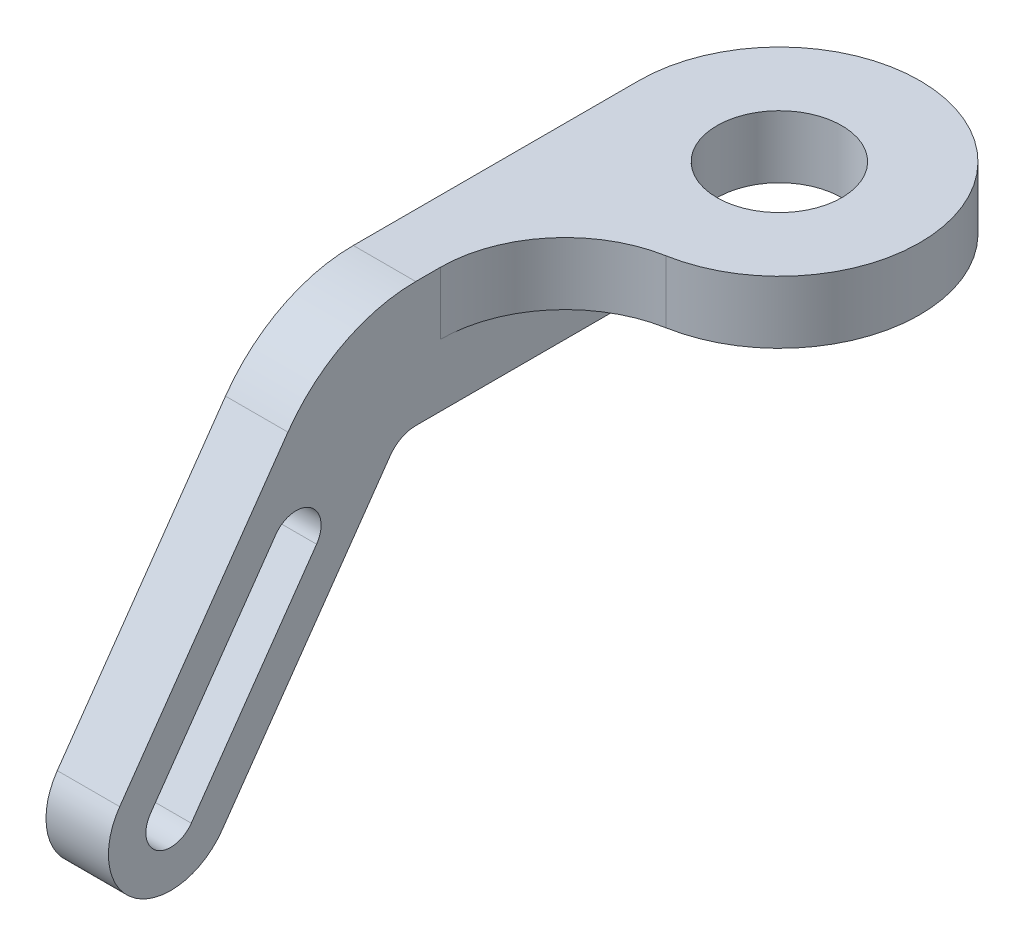
ISO-10303-21;
HEADER;
FILE_DESCRIPTION(('STEP AP214'),'2;1');
FILE_NAME('part.step','',(''),(''),'','','');
FILE_SCHEMA(('AUTOMOTIVE_DESIGN { 1 0 10303 214 1 1 1 1 }'));
ENDSEC;
DATA;
#1=APPLICATION_CONTEXT('core data for automotive mechanical design processes');
#2=APPLICATION_PROTOCOL_DEFINITION('international standard','automotive_design',2000,#1);
#3=PRODUCT_CONTEXT('',#1,'mechanical');
#4=PRODUCT('Part','Part','',(#3));
#5=PRODUCT_RELATED_PRODUCT_CATEGORY('part','',(#4));
#6=PRODUCT_DEFINITION_FORMATION('','',#4);
#7=PRODUCT_DEFINITION_CONTEXT('part definition',#1,'design');
#8=PRODUCT_DEFINITION('design','',#6,#7);
#9=PRODUCT_DEFINITION_SHAPE('','',#8);
#10=(LENGTH_UNIT() NAMED_UNIT(*) SI_UNIT(.MILLI.,.METRE.));
#11=(NAMED_UNIT(*) PLANE_ANGLE_UNIT() SI_UNIT($,.RADIAN.));
#12=(NAMED_UNIT(*) SI_UNIT($,.STERADIAN.) SOLID_ANGLE_UNIT());
#13=UNCERTAINTY_MEASURE_WITH_UNIT(LENGTH_MEASURE(1.E-05),#10,'distance_accuracy_value','');
#14=(GEOMETRIC_REPRESENTATION_CONTEXT(3) GLOBAL_UNCERTAINTY_ASSIGNED_CONTEXT((#13)) GLOBAL_UNIT_ASSIGNED_CONTEXT((#10,
#11,#12)) REPRESENTATION_CONTEXT('',''));
#15=CARTESIAN_POINT('',(0.,0.,0.));
#16=DIRECTION('',(0.,0.,1.));
#17=DIRECTION('',(1.,0.,0.));
#18=AXIS2_PLACEMENT_3D('',#15,#16,#17);
#19=CARTESIAN_POINT('',(10.,0.,-58.7769342618273));
#20=DIRECTION('',(0.,0.,1.));
#21=DIRECTION('',(1.,0.,0.));
#22=AXIS2_PLACEMENT_3D('',#19,#20,#21);
#23=PLANE('',#22);
#24=DIRECTION('',(-1.,0.,0.));
#25=VECTOR('',#24,1.);
#26=CARTESIAN_POINT('',(10.,-10.,-58.7769342618273));
#27=LINE('',#26,#25);
#28=CARTESIAN_POINT('',(10.,-10.,-58.7769342618273));
#29=VERTEX_POINT('',#28);
#30=CARTESIAN_POINT('',(0.,-10.,-58.7769342618273));
#31=VERTEX_POINT('',#30);
#32=EDGE_CURVE('E190',#29,#31,#27,.T.);
#33=ORIENTED_EDGE('',*,*,#32,.F.);
#34=DIRECTION('',(0.,1.,0.));
#35=VECTOR('',#34,1.);
#36=CARTESIAN_POINT('',(10.,0.,-58.7769342618273));
#37=LINE('',#36,#35);
#38=CARTESIAN_POINT('',(10.,-20.,-58.7769342618273));
#39=VERTEX_POINT('',#38);
#40=EDGE_CURVE('E209',#39,#29,#37,.T.);
#41=ORIENTED_EDGE('',*,*,#40,.F.);
#42=DIRECTION('',(-1.,0.,0.));
#43=VECTOR('',#42,1.);
#44=CARTESIAN_POINT('',(10.,-20.,-58.7769342618273));
#45=LINE('',#44,#43);
#46=CARTESIAN_POINT('',(0.,-20.,-58.7769342618273));
#47=VERTEX_POINT('',#46);
#48=EDGE_CURVE('E215',#39,#47,#45,.T.);
#49=ORIENTED_EDGE('',*,*,#48,.T.);
#50=DIRECTION('',(0.,1.,0.));
#51=VECTOR('',#50,1.);
#52=CARTESIAN_POINT('',(0.,0.,-58.7769342618273));
#53=LINE('',#52,#51);
#54=EDGE_CURVE('E223',#47,#31,#53,.T.);
#55=ORIENTED_EDGE('',*,*,#54,.T.);
#56=EDGE_LOOP('',(#33,#41,#49,#55));
#57=FACE_BOUND('',#56,.T.);
#58=ADVANCED_FACE('F40',(#57),#23,.F.);
#59=CARTESIAN_POINT('',(10.,-49.1491226573396,34.4145861810626));
#60=DIRECTION('',(0.,-0.573576436351044,-0.819152044288994));
#61=DIRECTION('',(0.,0.819152044288994,-0.573576436351044));
#62=AXIS2_PLACEMENT_3D('',#59,#60,#61);
#63=PLANE('',#62);
#64=DIRECTION('',(0.,-0.819152044288993,0.573576436351044));
#65=VECTOR('',#64,1.);
#66=CARTESIAN_POINT('',(10.,-49.1491226573396,34.4145861810626));
#67=LINE('',#66,#65);
#68=CARTESIAN_POINT('',(10.,-10.6605890912239,7.46462484343114));
#69=VERTEX_POINT('',#68);
#70=CARTESIAN_POINT('',(10.,-49.1491226573396,34.4145861810626));
#71=VERTEX_POINT('',#70);
#72=EDGE_CURVE('E201',#69,#71,#67,.T.);
#73=ORIENTED_EDGE('',*,*,#72,.F.);
#74=DIRECTION('',(-1.,0.,0.));
#75=VECTOR('',#74,1.);
#76=CARTESIAN_POINT('',(10.,-10.6605890912239,7.46462484343114));
#77=LINE('',#76,#75);
#78=CARTESIAN_POINT('',(0.,-10.6605890912239,7.46462484343114));
#79=VERTEX_POINT('',#78);
#80=EDGE_CURVE('E246',#69,#79,#77,.T.);
#81=ORIENTED_EDGE('',*,*,#80,.T.);
#82=DIRECTION('',(0.,-0.819152044288993,0.573576436351044));
#83=VECTOR('',#82,1.);
#84=CARTESIAN_POINT('',(0.,-49.1491226573396,34.4145861810626));
#85=LINE('',#84,#83);
#86=CARTESIAN_POINT('',(0.,-49.1491226573396,34.4145861810626));
#87=VERTEX_POINT('',#86);
#88=EDGE_CURVE('E200',#79,#87,#85,.T.);
#89=ORIENTED_EDGE('',*,*,#88,.T.);
#90=DIRECTION('',(-1.,0.,0.));
#91=VECTOR('',#90,1.);
#92=CARTESIAN_POINT('',(10.,-49.1491226573396,34.4145861810626));
#93=LINE('',#92,#91);
#94=EDGE_CURVE('E233',#71,#87,#93,.T.);
#95=ORIENTED_EDGE('',*,*,#94,.F.);
#96=EDGE_LOOP('',(#73,#81,#89,#95));
#97=FACE_BOUND('',#96,.T.);
#98=ADVANCED_FACE('F306',(#97),#63,.F.);
#99=CARTESIAN_POINT('',(10.,-20.,-10.4113410110349));
#100=DIRECTION('',(0.,0.573576436351043,0.819152044288994));
#101=DIRECTION('',(0.,-0.819152044288994,0.573576436351043));
#102=AXIS2_PLACEMENT_3D('',#99,#100,#101);
#103=PLANE('',#102);
#104=DIRECTION('',(0.,0.819152044288994,-0.573576436351044));
#105=VECTOR('',#104,1.);
#106=CARTESIAN_POINT('',(0.,-20.,-10.4113410110349));
#107=LINE('',#106,#105);
#108=CARTESIAN_POINT('',(0.,-60.6206513843605,18.0315452952828));
#109=VERTEX_POINT('',#108);
#110=CARTESIAN_POINT('',(0.,-22.1321178182448,-8.91841604234871));
#111=VERTEX_POINT('',#110);
#112=EDGE_CURVE('E217',#109,#111,#107,.T.);
#113=ORIENTED_EDGE('',*,*,#112,.T.);
#114=DIRECTION('',(-1.,0.,0.));
#115=VECTOR('',#114,1.);
#116=CARTESIAN_POINT('',(10.,-22.1321178182448,-8.91841604234871));
#117=LINE('',#116,#115);
#118=CARTESIAN_POINT('',(10.,-22.1321178182448,-8.91841604234871));
#119=VERTEX_POINT('',#118);
#120=EDGE_CURVE('E258',#111,#119,#117,.F.);
#121=ORIENTED_EDGE('',*,*,#120,.T.);
#122=DIRECTION('',(0.,0.819152044288994,-0.573576436351044));
#123=VECTOR('',#122,1.);
#124=CARTESIAN_POINT('',(10.,-20.,-10.4113410110349));
#125=LINE('',#124,#123);
#126=CARTESIAN_POINT('',(10.,-60.6206513843605,18.0315452952827));
#127=VERTEX_POINT('',#126);
#128=EDGE_CURVE('E203',#127,#119,#125,.T.);
#129=ORIENTED_EDGE('',*,*,#128,.F.);
#130=DIRECTION('',(-1.,0.,0.));
#131=VECTOR('',#130,1.);
#132=CARTESIAN_POINT('',(10.,-60.6206513843605,18.0315452952828));
#133=LINE('',#132,#131);
#134=EDGE_CURVE('E230',#127,#109,#133,.T.);
#135=ORIENTED_EDGE('',*,*,#134,.T.);
#136=EDGE_LOOP('',(#113,#121,#129,#135));
#137=FACE_BOUND('',#136,.T.);
#138=ADVANCED_FACE('F267',(#137),#103,.F.);
#139=CARTESIAN_POINT('',(10.,-20.,-58.7769342618273));
#140=DIRECTION('',(0.,1.,0.));
#141=DIRECTION('',(0.,0.,1.));
#142=AXIS2_PLACEMENT_3D('',#139,#140,#141);
#143=PLANE('',#142);
#144=DIRECTION('',(0.,0.,-1.));
#145=VECTOR('',#144,1.);
#146=CARTESIAN_POINT('',(10.,-20.,-58.7769342618273));
#147=LINE('',#146,#145);
#148=CARTESIAN_POINT('',(10.,-20.,-13.0141762637937));
#149=VERTEX_POINT('',#148);
#150=EDGE_CURVE('E207',#149,#39,#147,.T.);
#151=ORIENTED_EDGE('',*,*,#150,.F.);
#152=DIRECTION('',(-1.,0.,0.));
#153=VECTOR('',#152,1.);
#154=CARTESIAN_POINT('',(0.,-20.,-13.0141762637937));
#155=LINE('',#154,#153);
#156=CARTESIAN_POINT('',(0.,-20.,-13.0141762637937));
#157=VERTEX_POINT('',#156);
#158=EDGE_CURVE('E255',#149,#157,#155,.T.);
#159=ORIENTED_EDGE('',*,*,#158,.T.);
#160=DIRECTION('',(0.,0.,-1.));
#161=VECTOR('',#160,1.);
#162=CARTESIAN_POINT('',(0.,-20.,-58.7769342618273));
#163=LINE('',#162,#161);
#164=EDGE_CURVE('E220',#157,#47,#163,.T.);
#165=ORIENTED_EDGE('',*,*,#164,.T.);
#166=ORIENTED_EDGE('',*,*,#48,.F.);
#167=EDGE_LOOP('',(#151,#159,#165,#166));
#168=FACE_BOUND('',#167,.T.);
#169=ADVANCED_FACE('F276',(#168),#143,.F.);
#170=CARTESIAN_POINT('',(10.,0.,0.));
#171=DIRECTION('',(0.,-1.,0.));
#172=DIRECTION('',(0.,0.,-1.));
#173=AXIS2_PLACEMENT_3D('',#170,#171,#172);
#174=PLANE('',#173);
#175=DIRECTION('',(0.,0.,1.));
#176=VECTOR('',#175,1.);
#177=CARTESIAN_POINT('',(0.,0.,0.));
#178=LINE('',#177,#176);
#179=CARTESIAN_POINT('',(0.,0.,-58.7769342618273));
#180=VERTEX_POINT('',#179);
#181=CARTESIAN_POINT('',(0.,0.,-13.0141762637937));
#182=VERTEX_POINT('',#181);
#183=EDGE_CURVE('E204',#180,#182,#178,.T.);
#184=ORIENTED_EDGE('',*,*,#183,.T.);
#185=DIRECTION('',(-1.,0.,0.));
#186=VECTOR('',#185,1.);
#187=CARTESIAN_POINT('',(10.,0.,-13.0141762637937));
#188=LINE('',#187,#186);
#189=CARTESIAN_POINT('',(10.,0.,-13.0141762637937));
#190=VERTEX_POINT('',#189);
#191=EDGE_CURVE('E251',#182,#190,#188,.F.);
#192=ORIENTED_EDGE('',*,*,#191,.T.);
#193=DIRECTION('',(0.,0.,1.));
#194=VECTOR('',#193,1.);
#195=CARTESIAN_POINT('',(10.,0.,0.));
#196=LINE('',#195,#194);
#197=CARTESIAN_POINT('',(10.,0.,-16.9439329351235));
#198=VERTEX_POINT('',#197);
#199=EDGE_CURVE('E212',#198,#190,#196,.T.);
#200=ORIENTED_EDGE('',*,*,#199,.F.);
#201=CARTESIAN_POINT('',(30.,0.,-16.9439329351235));
#202=DIRECTION('',(0.,-1.,0.));
#203=DIRECTION('',(0.,0.,-1.));
#204=AXIS2_PLACEMENT_3D('',#201,#202,#203);
#205=CIRCLE('',#204,20.);
#206=CARTESIAN_POINT('',(26.4705882352941,0.,-36.6300512065136));
#207=VERTEX_POINT('',#206);
#208=EDGE_CURVE('E241',#198,#207,#205,.T.);
#209=ORIENTED_EDGE('',*,*,#208,.T.);
#210=CARTESIAN_POINT('',(22.5,0.,-58.7769342618273));
#211=DIRECTION('',(0.,1.,0.));
#212=DIRECTION('',(0.,0.,1.));
#213=AXIS2_PLACEMENT_3D('',#210,#211,#212);
#214=CIRCLE('',#213,22.5);
#215=EDGE_CURVE('E183',#207,#180,#214,.T.);
#216=ORIENTED_EDGE('',*,*,#215,.T.);
#217=EDGE_LOOP('',(#184,#192,#200,#209,#216));
#218=FACE_BOUND('',#217,.T.);
#219=CARTESIAN_POINT('',(22.5,0.,-58.7769342618273));
#220=DIRECTION('',(0.,1.,0.));
#221=DIRECTION('',(0.,0.,1.));
#222=AXIS2_PLACEMENT_3D('',#219,#220,#221);
#223=CIRCLE('',#222,10.);
#224=CARTESIAN_POINT('',(22.5,0.,-48.7769342618273));
#225=VERTEX_POINT('',#224);
#226=EDGE_CURVE('E157',#225,#225,#223,.T.);
#227=ORIENTED_EDGE('',*,*,#226,.F.);
#228=EDGE_LOOP('',(#227));
#229=FACE_BOUND('',#228,.T.);
#230=ADVANCED_FACE('F291',(#218,#229),#174,.F.);
#231=CARTESIAN_POINT('',(10.,0.,0.));
#232=DIRECTION('',(1.,0.,0.));
#233=DIRECTION('',(0.,0.,-1.));
#234=AXIS2_PLACEMENT_3D('',#231,#232,#233);
#235=PLANE('',#234);
#236=CARTESIAN_POINT('',(10.,-54.88488702085,26.2230657381727));
#237=DIRECTION('',(1.,0.,0.));
#238=DIRECTION('',(0.,0.,-1.));
#239=AXIS2_PLACEMENT_3D('',#236,#237,#238);
#240=CIRCLE('',#239,4.);
#241=CARTESIAN_POINT('',(10.,-52.5905812754459,29.4996739153287));
#242=VERTEX_POINT('',#241);
#243=CARTESIAN_POINT('',(10.,-57.1791927662542,22.9464575610167));
#244=VERTEX_POINT('',#243);
#245=EDGE_CURVE('E55',#242,#244,#240,.T.);
#246=ORIENTED_EDGE('',*,*,#245,.F.);
#247=DIRECTION('',(0.,-0.819152044288994,0.573576436351044));
#248=VECTOR('',#247,1.);
#249=CARTESIAN_POINT('',(10.,-52.5905812754459,29.4996739153287));
#250=LINE('',#249,#248);
#251=CARTESIAN_POINT('',(10.,-23.9202597253311,9.42449864304212));
#252=VERTEX_POINT('',#251);
#253=EDGE_CURVE('E151',#252,#242,#250,.T.);
#254=ORIENTED_EDGE('',*,*,#253,.F.);
#255=CARTESIAN_POINT('',(10.,-26.2145654707353,6.14789046588616));
#256=DIRECTION('',(1.,0.,0.));
#257=DIRECTION('',(0.,0.,-1.));
#258=AXIS2_PLACEMENT_3D('',#255,#256,#257);
#259=CIRCLE('',#258,3.99999999999999);
#260=CARTESIAN_POINT('',(10.,-28.5088712161394,2.87128228873019));
#261=VERTEX_POINT('',#260);
#262=EDGE_CURVE('E171',#261,#252,#259,.T.);
#263=ORIENTED_EDGE('',*,*,#262,.F.);
#264=DIRECTION('',(0.,0.819152044288994,-0.573576436351044));
#265=VECTOR('',#264,1.);
#266=CARTESIAN_POINT('',(10.,-57.1791927662542,22.9464575610167));
#267=LINE('',#266,#265);
#268=EDGE_CURVE('E165',#244,#261,#267,.T.);
#269=ORIENTED_EDGE('',*,*,#268,.F.);
#270=EDGE_LOOP('',(#246,#254,#263,#269));
#271=FACE_BOUND('',#270,.T.);
#272=ORIENTED_EDGE('',*,*,#199,.T.);
#273=CARTESIAN_POINT('',(10.,-25.,-13.0141762637937));
#274=DIRECTION('',(1.,0.,0.));
#275=DIRECTION('',(0.,0.,-1.));
#276=AXIS2_PLACEMENT_3D('',#273,#274,#275);
#277=CIRCLE('',#276,25.);
#278=EDGE_CURVE('E253',#190,#69,#277,.T.);
#279=ORIENTED_EDGE('',*,*,#278,.T.);
#280=ORIENTED_EDGE('',*,*,#72,.T.);
#281=CARTESIAN_POINT('',(10.,-54.88488702085,26.2230657381727));
#282=DIRECTION('',(1.,0.,0.));
#283=DIRECTION('',(0.,0.,-1.));
#284=AXIS2_PLACEMENT_3D('',#281,#282,#283);
#285=CIRCLE('',#284,10.);
#286=EDGE_CURVE('E197',#127,#71,#285,.F.);
#287=ORIENTED_EDGE('',*,*,#286,.F.);
#288=ORIENTED_EDGE('',*,*,#128,.T.);
#289=CARTESIAN_POINT('',(10.,-25.,-13.0141762637937));
#290=DIRECTION('',(1.,0.,0.));
#291=DIRECTION('',(0.,0.,-1.));
#292=AXIS2_PLACEMENT_3D('',#289,#290,#291);
#293=CIRCLE('',#292,5.);
#294=EDGE_CURVE('E11',#119,#149,#293,.F.);
#295=ORIENTED_EDGE('',*,*,#294,.T.);
#296=ORIENTED_EDGE('',*,*,#150,.T.);
#297=ORIENTED_EDGE('',*,*,#40,.T.);
#298=DIRECTION('',(0.,0.,1.));
#299=VECTOR('',#298,1.);
#300=CARTESIAN_POINT('',(10.,-10.,-36.2769342618273));
#301=LINE('',#300,#299);
#302=CARTESIAN_POINT('',(10.,-10.,-16.9439329351235));
#303=VERTEX_POINT('',#302);
#304=EDGE_CURVE('E188',#29,#303,#301,.T.);
#305=ORIENTED_EDGE('',*,*,#304,.T.);
#306=DIRECTION('',(0.,-1.,0.));
#307=VECTOR('',#306,1.);
#308=CARTESIAN_POINT('',(10.,0.,-16.9439329351235));
#309=LINE('',#308,#307);
#310=EDGE_CURVE('E236',#303,#198,#309,.F.);
#311=ORIENTED_EDGE('',*,*,#310,.T.);
#312=EDGE_LOOP('',(#272,#279,#280,#287,#288,#295,#296,#297,#305,#311));
#313=FACE_BOUND('',#312,.T.);
#314=ADVANCED_FACE('F272',(#271,#313),#235,.T.);
#315=CARTESIAN_POINT('',(0.,0.,0.));
#316=DIRECTION('',(1.,0.,0.));
#317=DIRECTION('',(0.,0.,-1.));
#318=AXIS2_PLACEMENT_3D('',#315,#316,#317);
#319=PLANE('',#318);
#320=DIRECTION('',(0.,0.819152044288994,-0.573576436351044));
#321=VECTOR('',#320,1.);
#322=CARTESIAN_POINT('',(0.,-52.5905812754459,29.4996739153287));
#323=LINE('',#322,#321);
#324=CARTESIAN_POINT('',(0.,-52.5905812754459,29.4996739153287));
#325=VERTEX_POINT('',#324);
#326=CARTESIAN_POINT('',(0.,-23.9202597253311,9.42449864304212));
#327=VERTEX_POINT('',#326);
#328=EDGE_CURVE('E163',#325,#327,#323,.T.);
#329=ORIENTED_EDGE('',*,*,#328,.F.);
#330=CARTESIAN_POINT('',(0.,-54.88488702085,26.2230657381727));
#331=DIRECTION('',(1.,0.,0.));
#332=DIRECTION('',(0.,0.,-1.));
#333=AXIS2_PLACEMENT_3D('',#330,#331,#332);
#334=CIRCLE('',#333,4.);
#335=CARTESIAN_POINT('',(0.,-57.1791927662542,22.9464575610167));
#336=VERTEX_POINT('',#335);
#337=EDGE_CURVE('E145',#336,#325,#334,.F.);
#338=ORIENTED_EDGE('',*,*,#337,.F.);
#339=DIRECTION('',(0.,-0.819152044288994,0.573576436351044));
#340=VECTOR('',#339,1.);
#341=CARTESIAN_POINT('',(0.,-57.1791927662542,22.9464575610167));
#342=LINE('',#341,#340);
#343=CARTESIAN_POINT('',(0.,-28.5088712161394,2.87128228873018));
#344=VERTEX_POINT('',#343);
#345=EDGE_CURVE('E154',#344,#336,#342,.T.);
#346=ORIENTED_EDGE('',*,*,#345,.F.);
#347=CARTESIAN_POINT('',(0.,-26.2145654707353,6.14789046588616));
#348=DIRECTION('',(1.,0.,0.));
#349=DIRECTION('',(0.,0.,-1.));
#350=AXIS2_PLACEMENT_3D('',#347,#348,#349);
#351=CIRCLE('',#350,3.99999999999999);
#352=EDGE_CURVE('E63',#327,#344,#351,.F.);
#353=ORIENTED_EDGE('',*,*,#352,.F.);
#354=EDGE_LOOP('',(#329,#338,#346,#353));
#355=FACE_BOUND('',#354,.T.);
#356=ORIENTED_EDGE('',*,*,#88,.F.);
#357=CARTESIAN_POINT('',(0.,-25.,-13.0141762637937));
#358=DIRECTION('',(1.,0.,0.));
#359=DIRECTION('',(0.,0.,-1.));
#360=AXIS2_PLACEMENT_3D('',#357,#358,#359);
#361=CIRCLE('',#360,25.);
#362=EDGE_CURVE('E249',#79,#182,#361,.F.);
#363=ORIENTED_EDGE('',*,*,#362,.T.);
#364=ORIENTED_EDGE('',*,*,#183,.F.);
#365=EDGE_CURVE('E222',#31,#180,#53,.T.);
#366=ORIENTED_EDGE('',*,*,#365,.F.);
#367=ORIENTED_EDGE('',*,*,#54,.F.);
#368=ORIENTED_EDGE('',*,*,#164,.F.);
#369=CARTESIAN_POINT('',(0.,-25.,-13.0141762637937));
#370=DIRECTION('',(1.,0.,0.));
#371=DIRECTION('',(0.,0.,-1.));
#372=AXIS2_PLACEMENT_3D('',#369,#370,#371);
#373=CIRCLE('',#372,5.);
#374=EDGE_CURVE('E48',#157,#111,#373,.T.);
#375=ORIENTED_EDGE('',*,*,#374,.T.);
#376=ORIENTED_EDGE('',*,*,#112,.F.);
#377=CARTESIAN_POINT('',(0.,-54.88488702085,26.2230657381727));
#378=DIRECTION('',(-1.,0.,0.));
#379=DIRECTION('',(0.,0.,1.));
#380=AXIS2_PLACEMENT_3D('',#377,#378,#379);
#381=CIRCLE('',#380,10.);
#382=EDGE_CURVE('E194',#109,#87,#381,.T.);
#383=ORIENTED_EDGE('',*,*,#382,.T.);
#384=EDGE_LOOP('',(#356,#363,#364,#366,#367,#368,#375,#376,#383));
#385=FACE_BOUND('',#384,.T.);
#386=ADVANCED_FACE('F160',(#355,#385),#319,.F.);
#387=CARTESIAN_POINT('',(38.2842712474619,-54.88488702085,26.2230657381727));
#388=DIRECTION('',(-1.,0.,0.));
#389=DIRECTION('',(0.,0.,1.));
#390=AXIS2_PLACEMENT_3D('',#387,#388,#389);
#391=CYLINDRICAL_SURFACE('',#390,10.);
#392=ORIENTED_EDGE('',*,*,#94,.T.);
#393=ORIENTED_EDGE('',*,*,#382,.F.);
#394=ORIENTED_EDGE('',*,*,#134,.F.);
#395=ORIENTED_EDGE('',*,*,#286,.T.);
#396=EDGE_LOOP('',(#392,#393,#394,#395));
#397=FACE_BOUND('',#396,.T.);
#398=ADVANCED_FACE('F308',(#397),#391,.T.);
#399=CARTESIAN_POINT('',(22.5,-10.,-58.7769342618273));
#400=DIRECTION('',(0.,1.,0.));
#401=DIRECTION('',(0.,0.,1.));
#402=AXIS2_PLACEMENT_3D('',#399,#400,#401);
#403=PLANE('',#402);
#404=CARTESIAN_POINT('',(22.5,-10.,-58.7769342618273));
#405=DIRECTION('',(0.,1.,0.));
#406=DIRECTION('',(0.,0.,1.));
#407=AXIS2_PLACEMENT_3D('',#404,#405,#406);
#408=CIRCLE('',#407,10.);
#409=CARTESIAN_POINT('',(22.5,-10.,-48.7769342618273));
#410=VERTEX_POINT('',#409);
#411=EDGE_CURVE('E180',#410,#410,#408,.T.);
#412=ORIENTED_EDGE('',*,*,#411,.T.);
#413=EDGE_LOOP('',(#412));
#414=FACE_BOUND('',#413,.T.);
#415=ORIENTED_EDGE('',*,*,#304,.F.);
#416=ORIENTED_EDGE('',*,*,#32,.T.);
#417=CARTESIAN_POINT('',(22.5,-10.,-58.7769342618273));
#418=DIRECTION('',(0.,1.,0.));
#419=DIRECTION('',(0.,0.,1.));
#420=AXIS2_PLACEMENT_3D('',#417,#418,#419);
#421=CIRCLE('',#420,22.5);
#422=CARTESIAN_POINT('',(26.4705882352941,-10.,-36.6300512065136));
#423=VERTEX_POINT('',#422);
#424=EDGE_CURVE('E186',#423,#31,#421,.T.);
#425=ORIENTED_EDGE('',*,*,#424,.F.);
#426=CARTESIAN_POINT('',(30.,-10.,-16.9439329351235));
#427=DIRECTION('',(0.,1.,0.));
#428=DIRECTION('',(0.,0.,1.));
#429=AXIS2_PLACEMENT_3D('',#426,#427,#428);
#430=CIRCLE('',#429,20.);
#431=EDGE_CURVE('E243',#423,#303,#430,.T.);
#432=ORIENTED_EDGE('',*,*,#431,.T.);
#433=EDGE_LOOP('',(#415,#416,#425,#432));
#434=FACE_BOUND('',#433,.T.);
#435=ADVANCED_FACE('F285',(#414,#434),#403,.F.);
#436=CARTESIAN_POINT('',(22.5,-10.,-58.7769342618273));
#437=DIRECTION('',(0.,1.,0.));
#438=DIRECTION('',(0.,0.,1.));
#439=AXIS2_PLACEMENT_3D('',#436,#437,#438);
#440=CYLINDRICAL_SURFACE('',#439,22.5);
#441=ORIENTED_EDGE('',*,*,#215,.F.);
#442=DIRECTION('',(0.,1.,0.));
#443=VECTOR('',#442,1.);
#444=CARTESIAN_POINT('',(26.4705882352941,-10.,-36.6300512065136));
#445=LINE('',#444,#443);
#446=EDGE_CURVE('E239',#207,#423,#445,.F.);
#447=ORIENTED_EDGE('',*,*,#446,.T.);
#448=ORIENTED_EDGE('',*,*,#424,.T.);
#449=ORIENTED_EDGE('',*,*,#365,.T.);
#450=EDGE_LOOP('',(#441,#447,#448,#449));
#451=FACE_BOUND('',#450,.T.);
#452=ADVANCED_FACE('F296',(#451),#440,.T.);
#453=CARTESIAN_POINT('',(22.5,-10.,-58.7769342618273));
#454=DIRECTION('',(0.,1.,0.));
#455=DIRECTION('',(0.,0.,1.));
#456=AXIS2_PLACEMENT_3D('',#453,#454,#455);
#457=CYLINDRICAL_SURFACE('',#456,10.);
#458=ORIENTED_EDGE('',*,*,#411,.F.);
#459=EDGE_LOOP('',(#458));
#460=FACE_BOUND('',#459,.T.);
#461=ORIENTED_EDGE('',*,*,#226,.T.);
#462=EDGE_LOOP('',(#461));
#463=FACE_BOUND('',#462,.T.);
#464=ADVANCED_FACE('F333',(#460,#463),#457,.F.);
#465=CARTESIAN_POINT('',(30.,-10.,-16.9439329351235));
#466=DIRECTION('',(0.,1.,0.));
#467=DIRECTION('',(0.,0.,1.));
#468=AXIS2_PLACEMENT_3D('',#465,#466,#467);
#469=CYLINDRICAL_SURFACE('',#468,20.);
#470=ORIENTED_EDGE('',*,*,#431,.F.);
#471=ORIENTED_EDGE('',*,*,#446,.F.);
#472=ORIENTED_EDGE('',*,*,#208,.F.);
#473=ORIENTED_EDGE('',*,*,#310,.F.);
#474=EDGE_LOOP('',(#470,#471,#472,#473));
#475=FACE_BOUND('',#474,.T.);
#476=ADVANCED_FACE('F288',(#475),#469,.F.);
#477=CARTESIAN_POINT('',(10.,-25.,-13.0141762637937));
#478=DIRECTION('',(-1.,0.,0.));
#479=DIRECTION('',(0.,0.,1.));
#480=AXIS2_PLACEMENT_3D('',#477,#478,#479);
#481=CYLINDRICAL_SURFACE('',#480,25.);
#482=ORIENTED_EDGE('',*,*,#278,.F.);
#483=ORIENTED_EDGE('',*,*,#191,.F.);
#484=ORIENTED_EDGE('',*,*,#362,.F.);
#485=ORIENTED_EDGE('',*,*,#80,.F.);
#486=EDGE_LOOP('',(#482,#483,#484,#485));
#487=FACE_BOUND('',#486,.T.);
#488=ADVANCED_FACE('F301',(#487),#481,.T.);
#489=CARTESIAN_POINT('',(10.,-25.,-13.0141762637937));
#490=DIRECTION('',(1.,0.,0.));
#491=DIRECTION('',(0.,0.,-1.));
#492=AXIS2_PLACEMENT_3D('',#489,#490,#491);
#493=CYLINDRICAL_SURFACE('',#492,5.);
#494=ORIENTED_EDGE('',*,*,#294,.F.);
#495=ORIENTED_EDGE('',*,*,#120,.F.);
#496=ORIENTED_EDGE('',*,*,#374,.F.);
#497=ORIENTED_EDGE('',*,*,#158,.F.);
#498=EDGE_LOOP('',(#494,#495,#496,#497));
#499=FACE_BOUND('',#498,.T.);
#500=ADVANCED_FACE('F42',(#499),#493,.F.);
#501=CARTESIAN_POINT('',(-0.000999999999999265,-54.88488702085,26.2230657381727));
#502=DIRECTION('',(1.,0.,0.));
#503=DIRECTION('',(0.,0.,-1.));
#504=AXIS2_PLACEMENT_3D('',#501,#502,#503);
#505=CYLINDRICAL_SURFACE('',#504,4.);
#506=ORIENTED_EDGE('',*,*,#337,.T.);
#507=DIRECTION('',(1.,0.,0.));
#508=VECTOR('',#507,1.);
#509=CARTESIAN_POINT('',(-0.000999999999999265,-52.5905812754459,29.4996739153287));
#510=LINE('',#509,#508);
#511=EDGE_CURVE('E158',#325,#242,#510,.T.);
#512=ORIENTED_EDGE('',*,*,#511,.T.);
#513=ORIENTED_EDGE('',*,*,#245,.T.);
#514=DIRECTION('',(1.,0.,0.));
#515=VECTOR('',#514,1.);
#516=CARTESIAN_POINT('',(-0.000999999999999265,-57.1791927662542,22.9464575610167));
#517=LINE('',#516,#515);
#518=EDGE_CURVE('E141',#336,#244,#517,.T.);
#519=ORIENTED_EDGE('',*,*,#518,.F.);
#520=EDGE_LOOP('',(#506,#512,#513,#519));
#521=FACE_BOUND('',#520,.T.);
#522=ADVANCED_FACE('F143',(#521),#505,.F.);
#523=CARTESIAN_POINT('',(-0.000999999999999265,-52.5905812754459,29.4996739153287));
#524=DIRECTION('',(0.,0.573576436351044,0.819152044288994));
#525=DIRECTION('',(0.,-0.819152044288994,0.573576436351044));
#526=AXIS2_PLACEMENT_3D('',#523,#524,#525);
#527=PLANE('',#526);
#528=ORIENTED_EDGE('',*,*,#328,.T.);
#529=DIRECTION('',(1.,0.,0.));
#530=VECTOR('',#529,1.);
#531=CARTESIAN_POINT('',(-0.000999999999999265,-23.9202597253311,9.42449864304212));
#532=LINE('',#531,#530);
#533=EDGE_CURVE('E177',#327,#252,#532,.T.);
#534=ORIENTED_EDGE('',*,*,#533,.T.);
#535=ORIENTED_EDGE('',*,*,#253,.T.);
#536=ORIENTED_EDGE('',*,*,#511,.F.);
#537=EDGE_LOOP('',(#528,#534,#535,#536));
#538=FACE_BOUND('',#537,.T.);
#539=ADVANCED_FACE('F341',(#538),#527,.F.);
#540=CARTESIAN_POINT('',(-0.000999999999999265,-26.2145654707353,6.14789046588616));
#541=DIRECTION('',(1.,0.,0.));
#542=DIRECTION('',(0.,0.,-1.));
#543=AXIS2_PLACEMENT_3D('',#540,#541,#542);
#544=CYLINDRICAL_SURFACE('',#543,3.99999999999999);
#545=ORIENTED_EDGE('',*,*,#352,.T.);
#546=DIRECTION('',(1.,0.,0.));
#547=VECTOR('',#546,1.);
#548=CARTESIAN_POINT('',(-0.000999999999999265,-28.5088712161394,2.87128228873019));
#549=LINE('',#548,#547);
#550=EDGE_CURVE('E150',#344,#261,#549,.T.);
#551=ORIENTED_EDGE('',*,*,#550,.T.);
#552=ORIENTED_EDGE('',*,*,#262,.T.);
#553=ORIENTED_EDGE('',*,*,#533,.F.);
#554=EDGE_LOOP('',(#545,#551,#552,#553));
#555=FACE_BOUND('',#554,.T.);
#556=ADVANCED_FACE('F346',(#555),#544,.F.);
#557=CARTESIAN_POINT('',(-0.000999999999999265,-57.1791927662542,22.9464575610167));
#558=DIRECTION('',(0.,-0.573576436351044,-0.819152044288994));
#559=DIRECTION('',(0.,0.819152044288994,-0.573576436351044));
#560=AXIS2_PLACEMENT_3D('',#557,#558,#559);
#561=PLANE('',#560);
#562=ORIENTED_EDGE('',*,*,#345,.T.);
#563=ORIENTED_EDGE('',*,*,#518,.T.);
#564=ORIENTED_EDGE('',*,*,#268,.T.);
#565=ORIENTED_EDGE('',*,*,#550,.F.);
#566=EDGE_LOOP('',(#562,#563,#564,#565));
#567=FACE_BOUND('',#566,.T.);
#568=ADVANCED_FACE('F155',(#567),#561,.F.);
#569=CLOSED_SHELL('',(#58,#98,#138,#169,#230,#314,#386,#398,#435,#452,#464,#476,#488,#500,#522,
#539,#556,#568));
#570=MANIFOLD_SOLID_BREP('B2',#569);
#571=ADVANCED_BREP_SHAPE_REPRESENTATION('',(#18,#570),#14);
#572=SHAPE_DEFINITION_REPRESENTATION(#9,#571);
ENDSEC;
END-ISO-10303-21;
